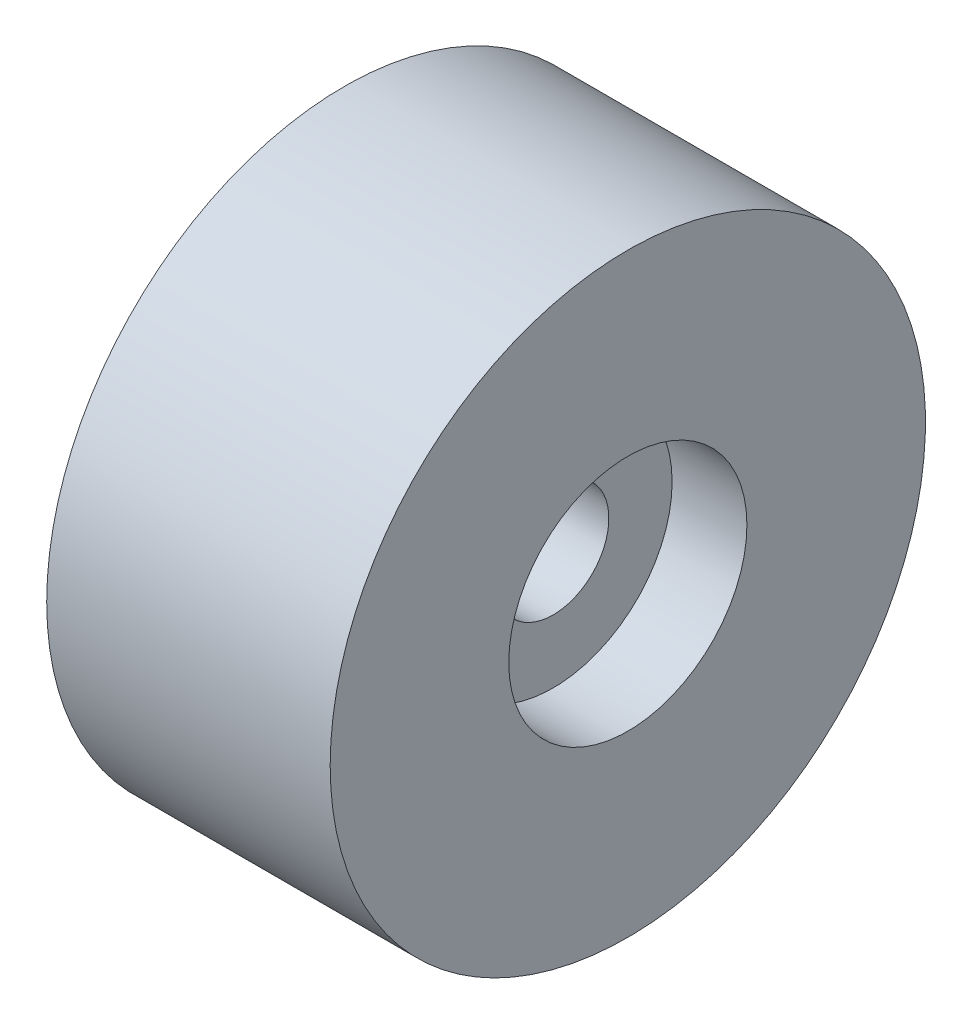
ISO-10303-21;
HEADER;
FILE_DESCRIPTION(('STEP AP214'),'2;1');
FILE_NAME('part.step','',(''),(''),'','','');
FILE_SCHEMA(('AUTOMOTIVE_DESIGN { 1 0 10303 214 1 1 1 1 }'));
ENDSEC;
DATA;
#1=APPLICATION_CONTEXT('core data for automotive mechanical design processes');
#2=APPLICATION_PROTOCOL_DEFINITION('international standard','automotive_design',2000,#1);
#3=PRODUCT_CONTEXT('',#1,'mechanical');
#4=PRODUCT('Part','Part','',(#3));
#5=PRODUCT_RELATED_PRODUCT_CATEGORY('part','',(#4));
#6=PRODUCT_DEFINITION_FORMATION('','',#4);
#7=PRODUCT_DEFINITION_CONTEXT('part definition',#1,'design');
#8=PRODUCT_DEFINITION('design','',#6,#7);
#9=PRODUCT_DEFINITION_SHAPE('','',#8);
#10=(LENGTH_UNIT() NAMED_UNIT(*) SI_UNIT(.MILLI.,.METRE.));
#11=(NAMED_UNIT(*) PLANE_ANGLE_UNIT() SI_UNIT($,.RADIAN.));
#12=(NAMED_UNIT(*) SI_UNIT($,.STERADIAN.) SOLID_ANGLE_UNIT());
#13=UNCERTAINTY_MEASURE_WITH_UNIT(LENGTH_MEASURE(1.E-05),#10,'distance_accuracy_value','');
#14=(GEOMETRIC_REPRESENTATION_CONTEXT(3) GLOBAL_UNCERTAINTY_ASSIGNED_CONTEXT((#13)) GLOBAL_UNIT_ASSIGNED_CONTEXT((#10,
#11,#12)) REPRESENTATION_CONTEXT('',''));
#15=CARTESIAN_POINT('',(0.,0.,0.));
#16=DIRECTION('',(0.,0.,1.));
#17=DIRECTION('',(1.,0.,0.));
#18=AXIS2_PLACEMENT_3D('',#15,#16,#17);
#19=CARTESIAN_POINT('',(-62.8571428571427,0.,0.));
#20=DIRECTION('',(-1.,0.,0.));
#21=DIRECTION('',(0.,0.,1.));
#22=AXIS2_PLACEMENT_3D('',#19,#20,#21);
#23=CYLINDRICAL_SURFACE('',#22,133.35);
#24=CARTESIAN_POINT('',(-63.5,0.,0.));
#25=DIRECTION('',(-1.,0.,0.));
#26=DIRECTION('',(0.,0.,1.));
#27=AXIS2_PLACEMENT_3D('',#24,#25,#26);
#28=CIRCLE('',#27,133.35);
#29=CARTESIAN_POINT('',(-63.5,0.,133.35));
#30=VERTEX_POINT('',#29);
#31=EDGE_CURVE('E10',#30,#30,#28,.T.);
#32=ORIENTED_EDGE('',*,*,#31,.F.);
#33=EDGE_LOOP('',(#32));
#34=FACE_BOUND('',#33,.T.);
#35=CARTESIAN_POINT('',(63.5,0.,0.));
#36=DIRECTION('',(-1.,0.,0.));
#37=DIRECTION('',(0.,0.,1.));
#38=AXIS2_PLACEMENT_3D('',#35,#36,#37);
#39=CIRCLE('',#38,133.35);
#40=CARTESIAN_POINT('',(63.5,0.,133.35));
#41=VERTEX_POINT('',#40);
#42=EDGE_CURVE('E60',#41,#41,#39,.T.);
#43=ORIENTED_EDGE('',*,*,#42,.T.);
#44=EDGE_LOOP('',(#43));
#45=FACE_BOUND('',#44,.T.);
#46=ADVANCED_FACE('F41',(#34,#45),#23,.T.);
#47=CARTESIAN_POINT('',(-63.5,-133.35,0.));
#48=DIRECTION('',(-1.,0.,0.));
#49=DIRECTION('',(0.,0.,1.));
#50=AXIS2_PLACEMENT_3D('',#47,#48,#49);
#51=PLANE('',#50);
#52=ORIENTED_EDGE('',*,*,#31,.T.);
#53=EDGE_LOOP('',(#52));
#54=FACE_BOUND('',#53,.T.);
#55=CARTESIAN_POINT('',(-63.5,0.,0.));
#56=DIRECTION('',(-1.,0.,0.));
#57=DIRECTION('',(0.,0.,1.));
#58=AXIS2_PLACEMENT_3D('',#55,#56,#57);
#59=CIRCLE('',#58,53.35);
#60=CARTESIAN_POINT('',(-63.5,0.,53.35));
#61=VERTEX_POINT('',#60);
#62=EDGE_CURVE('E47',#61,#61,#59,.T.);
#63=ORIENTED_EDGE('',*,*,#62,.F.);
#64=EDGE_LOOP('',(#63));
#65=FACE_BOUND('',#64,.T.);
#66=ADVANCED_FACE('F92',(#54,#65),#51,.T.);
#67=CARTESIAN_POINT('',(-62.8571428571427,0.,0.));
#68=DIRECTION('',(-1.,0.,0.));
#69=DIRECTION('',(0.,0.,1.));
#70=AXIS2_PLACEMENT_3D('',#67,#68,#69);
#71=CYLINDRICAL_SURFACE('',#70,53.35);
#72=ORIENTED_EDGE('',*,*,#62,.T.);
#73=EDGE_LOOP('',(#72));
#74=FACE_BOUND('',#73,.T.);
#75=CARTESIAN_POINT('',(-30.,0.,0.));
#76=DIRECTION('',(-1.,0.,0.));
#77=DIRECTION('',(0.,0.,1.));
#78=AXIS2_PLACEMENT_3D('',#75,#76,#77);
#79=CIRCLE('',#78,53.35);
#80=CARTESIAN_POINT('',(-30.,0.,53.35));
#81=VERTEX_POINT('',#80);
#82=EDGE_CURVE('E51',#81,#81,#79,.T.);
#83=ORIENTED_EDGE('',*,*,#82,.F.);
#84=EDGE_LOOP('',(#83));
#85=FACE_BOUND('',#84,.T.);
#86=ADVANCED_FACE('F89',(#74,#85),#71,.F.);
#87=CARTESIAN_POINT('',(-30.,-53.35,0.));
#88=DIRECTION('',(-1.,0.,0.));
#89=DIRECTION('',(0.,0.,1.));
#90=AXIS2_PLACEMENT_3D('',#87,#88,#89);
#91=PLANE('',#90);
#92=ORIENTED_EDGE('',*,*,#82,.T.);
#93=EDGE_LOOP('',(#92));
#94=FACE_BOUND('',#93,.T.);
#95=CARTESIAN_POINT('',(-30.,0.,0.));
#96=DIRECTION('',(-1.,0.,0.));
#97=DIRECTION('',(0.,0.,1.));
#98=AXIS2_PLACEMENT_3D('',#95,#96,#97);
#99=CIRCLE('',#98,25.);
#100=CARTESIAN_POINT('',(-30.,0.,25.));
#101=VERTEX_POINT('',#100);
#102=EDGE_CURVE('E55',#101,#101,#99,.T.);
#103=ORIENTED_EDGE('',*,*,#102,.F.);
#104=EDGE_LOOP('',(#103));
#105=FACE_BOUND('',#104,.T.);
#106=ADVANCED_FACE('F78',(#94,#105),#91,.T.);
#107=CARTESIAN_POINT('',(-62.8571428571427,0.,0.));
#108=DIRECTION('',(-1.,0.,0.));
#109=DIRECTION('',(0.,0.,1.));
#110=AXIS2_PLACEMENT_3D('',#107,#108,#109);
#111=CYLINDRICAL_SURFACE('',#110,25.);
#112=ORIENTED_EDGE('',*,*,#102,.T.);
#113=EDGE_LOOP('',(#112));
#114=FACE_BOUND('',#113,.T.);
#115=CARTESIAN_POINT('',(30.,0.,0.));
#116=DIRECTION('',(-1.,0.,0.));
#117=DIRECTION('',(0.,0.,1.));
#118=AXIS2_PLACEMENT_3D('',#115,#116,#117);
#119=CIRCLE('',#118,25.);
#120=CARTESIAN_POINT('',(30.,0.,25.));
#121=VERTEX_POINT('',#120);
#122=EDGE_CURVE('E69',#121,#121,#119,.T.);
#123=ORIENTED_EDGE('',*,*,#122,.F.);
#124=EDGE_LOOP('',(#123));
#125=FACE_BOUND('',#124,.T.);
#126=ADVANCED_FACE('F75',(#114,#125),#111,.F.);
#127=CARTESIAN_POINT('',(63.5,-133.35,0.));
#128=DIRECTION('',(1.,0.,0.));
#129=DIRECTION('',(0.,0.,1.));
#130=AXIS2_PLACEMENT_3D('',#127,#128,#129);
#131=PLANE('',#130);
#132=ORIENTED_EDGE('',*,*,#42,.F.);
#133=EDGE_LOOP('',(#132));
#134=FACE_BOUND('',#133,.T.);
#135=CARTESIAN_POINT('',(63.5,0.,0.));
#136=DIRECTION('',(-1.,0.,0.));
#137=DIRECTION('',(0.,0.,1.));
#138=AXIS2_PLACEMENT_3D('',#135,#136,#137);
#139=CIRCLE('',#138,53.35);
#140=CARTESIAN_POINT('',(63.5,0.,53.35));
#141=VERTEX_POINT('',#140);
#142=EDGE_CURVE('E63',#141,#141,#139,.T.);
#143=ORIENTED_EDGE('',*,*,#142,.T.);
#144=EDGE_LOOP('',(#143));
#145=FACE_BOUND('',#144,.T.);
#146=ADVANCED_FACE('F77',(#134,#145),#131,.T.);
#147=CARTESIAN_POINT('',(62.8571428571427,0.,0.));
#148=DIRECTION('',(1.,0.,0.));
#149=DIRECTION('',(0.,0.,1.));
#150=AXIS2_PLACEMENT_3D('',#147,#148,#149);
#151=CYLINDRICAL_SURFACE('',#150,53.35);
#152=ORIENTED_EDGE('',*,*,#142,.F.);
#153=EDGE_LOOP('',(#152));
#154=FACE_BOUND('',#153,.T.);
#155=CARTESIAN_POINT('',(30.,0.,0.));
#156=DIRECTION('',(-1.,0.,0.));
#157=DIRECTION('',(0.,0.,1.));
#158=AXIS2_PLACEMENT_3D('',#155,#156,#157);
#159=CIRCLE('',#158,53.35);
#160=CARTESIAN_POINT('',(30.,0.,53.35));
#161=VERTEX_POINT('',#160);
#162=EDGE_CURVE('E66',#161,#161,#159,.T.);
#163=ORIENTED_EDGE('',*,*,#162,.T.);
#164=EDGE_LOOP('',(#163));
#165=FACE_BOUND('',#164,.T.);
#166=ADVANCED_FACE('F85',(#154,#165),#151,.F.);
#167=CARTESIAN_POINT('',(30.,-53.35,0.));
#168=DIRECTION('',(1.,0.,0.));
#169=DIRECTION('',(0.,0.,1.));
#170=AXIS2_PLACEMENT_3D('',#167,#168,#169);
#171=PLANE('',#170);
#172=ORIENTED_EDGE('',*,*,#162,.F.);
#173=EDGE_LOOP('',(#172));
#174=FACE_BOUND('',#173,.T.);
#175=ORIENTED_EDGE('',*,*,#122,.T.);
#176=EDGE_LOOP('',(#175));
#177=FACE_BOUND('',#176,.T.);
#178=ADVANCED_FACE('F73',(#174,#177),#171,.T.);
#179=CLOSED_SHELL('',(#46,#66,#86,#106,#126,#146,#166,#178));
#180=MANIFOLD_SOLID_BREP('B2',#179);
#181=ADVANCED_BREP_SHAPE_REPRESENTATION('',(#18,#180),#14);
#182=SHAPE_DEFINITION_REPRESENTATION(#9,#181);
ENDSEC;
END-ISO-10303-21;
